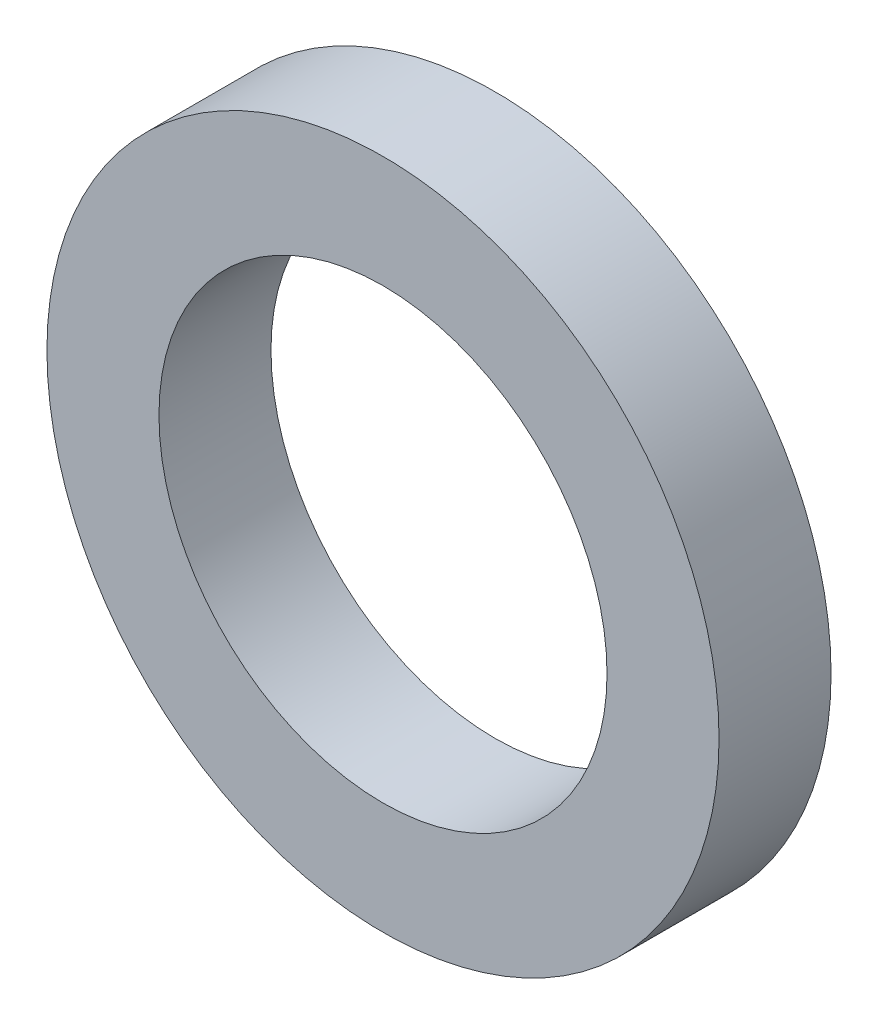
ISO-10303-21;
HEADER;
FILE_DESCRIPTION(('STEP AP214'),'2;1');
FILE_NAME('part.step','',(''),(''),'','','');
FILE_SCHEMA(('AUTOMOTIVE_DESIGN { 1 0 10303 214 1 1 1 1 }'));
ENDSEC;
DATA;
#1=APPLICATION_CONTEXT('core data for automotive mechanical design processes');
#2=APPLICATION_PROTOCOL_DEFINITION('international standard','automotive_design',2000,#1);
#3=PRODUCT_CONTEXT('',#1,'mechanical');
#4=PRODUCT('Part','Part','',(#3));
#5=PRODUCT_RELATED_PRODUCT_CATEGORY('part','',(#4));
#6=PRODUCT_DEFINITION_FORMATION('','',#4);
#7=PRODUCT_DEFINITION_CONTEXT('part definition',#1,'design');
#8=PRODUCT_DEFINITION('design','',#6,#7);
#9=PRODUCT_DEFINITION_SHAPE('','',#8);
#10=(LENGTH_UNIT() NAMED_UNIT(*) SI_UNIT(.MILLI.,.METRE.));
#11=(NAMED_UNIT(*) PLANE_ANGLE_UNIT() SI_UNIT($,.RADIAN.));
#12=(NAMED_UNIT(*) SI_UNIT($,.STERADIAN.) SOLID_ANGLE_UNIT());
#13=UNCERTAINTY_MEASURE_WITH_UNIT(LENGTH_MEASURE(1.E-05),#10,'distance_accuracy_value','');
#14=(GEOMETRIC_REPRESENTATION_CONTEXT(3) GLOBAL_UNCERTAINTY_ASSIGNED_CONTEXT((#13)) GLOBAL_UNIT_ASSIGNED_CONTEXT((#10,
#11,#12)) REPRESENTATION_CONTEXT('',''));
#15=CARTESIAN_POINT('',(0.,0.,0.));
#16=DIRECTION('',(0.,0.,1.));
#17=DIRECTION('',(1.,0.,0.));
#18=AXIS2_PLACEMENT_3D('',#15,#16,#17);
#19=CARTESIAN_POINT('',(0.,0.,1.));
#20=DIRECTION('',(0.,0.,-1.));
#21=DIRECTION('',(-1.,0.,0.));
#22=AXIS2_PLACEMENT_3D('',#19,#20,#21);
#23=CYLINDRICAL_SURFACE('',#22,3.);
#24=CARTESIAN_POINT('',(0.,0.,1.));
#25=DIRECTION('',(0.,0.,1.));
#26=DIRECTION('',(1.,0.,0.));
#27=AXIS2_PLACEMENT_3D('',#24,#25,#26);
#28=CIRCLE('',#27,3.);
#29=CARTESIAN_POINT('',(3.,0.,1.));
#30=VERTEX_POINT('',#29);
#31=EDGE_CURVE('E10',#30,#30,#28,.T.);
#32=ORIENTED_EDGE('',*,*,#31,.F.);
#33=EDGE_LOOP('',(#32));
#34=FACE_BOUND('',#33,.T.);
#35=CARTESIAN_POINT('',(0.,0.,0.));
#36=DIRECTION('',(0.,0.,1.));
#37=DIRECTION('',(1.,0.,0.));
#38=AXIS2_PLACEMENT_3D('',#35,#36,#37);
#39=CIRCLE('',#38,3.);
#40=CARTESIAN_POINT('',(3.,0.,0.));
#41=VERTEX_POINT('',#40);
#42=EDGE_CURVE('E42',#41,#41,#39,.T.);
#43=ORIENTED_EDGE('',*,*,#42,.T.);
#44=EDGE_LOOP('',(#43));
#45=FACE_BOUND('',#44,.T.);
#46=ADVANCED_FACE('F39',(#34,#45),#23,.T.);
#47=CARTESIAN_POINT('',(0.,0.,1.));
#48=DIRECTION('',(0.,0.,1.));
#49=DIRECTION('',(1.,0.,0.));
#50=AXIS2_PLACEMENT_3D('',#47,#48,#49);
#51=PLANE('',#50);
#52=CARTESIAN_POINT('',(0.,0.,1.));
#53=DIRECTION('',(0.,0.,1.));
#54=DIRECTION('',(1.,0.,0.));
#55=AXIS2_PLACEMENT_3D('',#52,#53,#54);
#56=CIRCLE('',#55,2.);
#57=CARTESIAN_POINT('',(2.,0.,1.));
#58=VERTEX_POINT('',#57);
#59=EDGE_CURVE('E51',#58,#58,#56,.T.);
#60=ORIENTED_EDGE('',*,*,#59,.F.);
#61=EDGE_LOOP('',(#60));
#62=FACE_BOUND('',#61,.T.);
#63=ORIENTED_EDGE('',*,*,#31,.T.);
#64=EDGE_LOOP('',(#63));
#65=FACE_BOUND('',#64,.T.);
#66=ADVANCED_FACE('F66',(#62,#65),#51,.T.);
#67=CARTESIAN_POINT('',(0.,0.,0.));
#68=DIRECTION('',(0.,0.,1.));
#69=DIRECTION('',(1.,0.,0.));
#70=AXIS2_PLACEMENT_3D('',#67,#68,#69);
#71=PLANE('',#70);
#72=CARTESIAN_POINT('',(0.,0.,0.));
#73=DIRECTION('',(0.,0.,1.));
#74=DIRECTION('',(1.,0.,0.));
#75=AXIS2_PLACEMENT_3D('',#72,#73,#74);
#76=CIRCLE('',#75,2.);
#77=CARTESIAN_POINT('',(2.,0.,0.));
#78=VERTEX_POINT('',#77);
#79=EDGE_CURVE('E49',#78,#78,#76,.T.);
#80=ORIENTED_EDGE('',*,*,#79,.T.);
#81=EDGE_LOOP('',(#80));
#82=FACE_BOUND('',#81,.T.);
#83=ORIENTED_EDGE('',*,*,#42,.F.);
#84=EDGE_LOOP('',(#83));
#85=FACE_BOUND('',#84,.T.);
#86=ADVANCED_FACE('F57',(#82,#85),#71,.F.);
#87=CARTESIAN_POINT('',(0.,0.,0.));
#88=DIRECTION('',(0.,0.,1.));
#89=DIRECTION('',(1.,0.,0.));
#90=AXIS2_PLACEMENT_3D('',#87,#88,#89);
#91=CYLINDRICAL_SURFACE('',#90,2.);
#92=ORIENTED_EDGE('',*,*,#79,.F.);
#93=EDGE_LOOP('',(#92));
#94=FACE_BOUND('',#93,.T.);
#95=ORIENTED_EDGE('',*,*,#59,.T.);
#96=EDGE_LOOP('',(#95));
#97=FACE_BOUND('',#96,.T.);
#98=ADVANCED_FACE('F60',(#94,#97),#91,.F.);
#99=CLOSED_SHELL('',(#46,#66,#86,#98));
#100=MANIFOLD_SOLID_BREP('B2',#99);
#101=ADVANCED_BREP_SHAPE_REPRESENTATION('',(#18,#100),#14);
#102=SHAPE_DEFINITION_REPRESENTATION(#9,#101);
ENDSEC;
END-ISO-10303-21;
